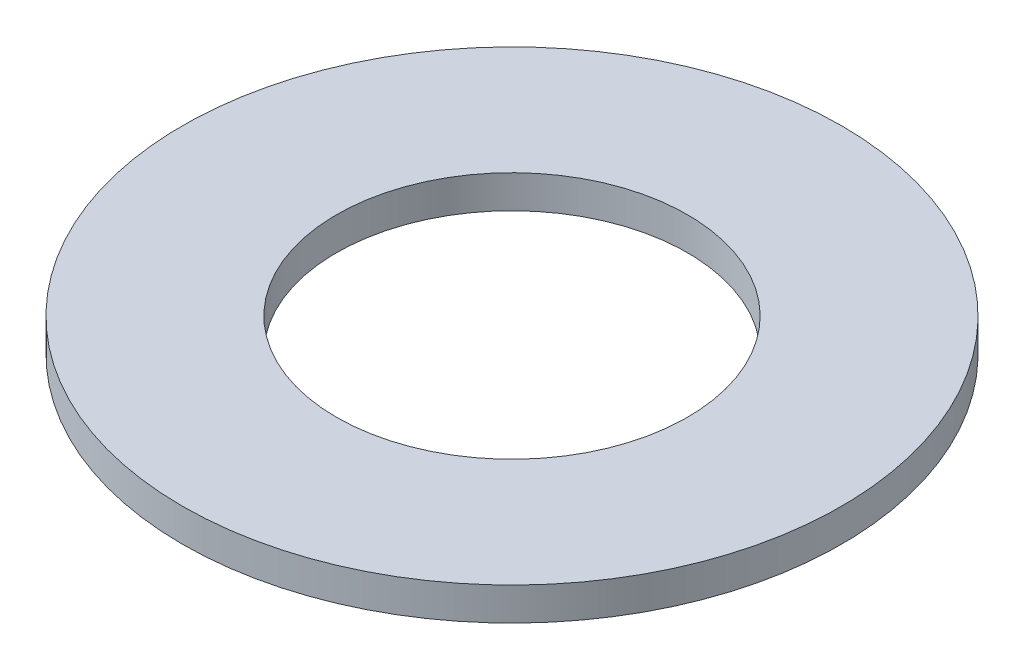
ISO-10303-21;
HEADER;
FILE_DESCRIPTION(('STEP AP214'),'2;1');
FILE_NAME('part.step','',(''),(''),'','','');
FILE_SCHEMA(('AUTOMOTIVE_DESIGN { 1 0 10303 214 1 1 1 1 }'));
ENDSEC;
DATA;
#1=APPLICATION_CONTEXT('core data for automotive mechanical design processes');
#2=APPLICATION_PROTOCOL_DEFINITION('international standard','automotive_design',2000,#1);
#3=PRODUCT_CONTEXT('',#1,'mechanical');
#4=PRODUCT('Part','Part','',(#3));
#5=PRODUCT_RELATED_PRODUCT_CATEGORY('part','',(#4));
#6=PRODUCT_DEFINITION_FORMATION('','',#4);
#7=PRODUCT_DEFINITION_CONTEXT('part definition',#1,'design');
#8=PRODUCT_DEFINITION('design','',#6,#7);
#9=PRODUCT_DEFINITION_SHAPE('','',#8);
#10=(LENGTH_UNIT() NAMED_UNIT(*) SI_UNIT(.MILLI.,.METRE.));
#11=(NAMED_UNIT(*) PLANE_ANGLE_UNIT() SI_UNIT($,.RADIAN.));
#12=(NAMED_UNIT(*) SI_UNIT($,.STERADIAN.) SOLID_ANGLE_UNIT());
#13=UNCERTAINTY_MEASURE_WITH_UNIT(LENGTH_MEASURE(1.E-05),#10,'distance_accuracy_value','');
#14=(GEOMETRIC_REPRESENTATION_CONTEXT(3) GLOBAL_UNCERTAINTY_ASSIGNED_CONTEXT((#13)) GLOBAL_UNIT_ASSIGNED_CONTEXT((#10,
#11,#12)) REPRESENTATION_CONTEXT('',''));
#15=CARTESIAN_POINT('',(0.,0.,0.));
#16=DIRECTION('',(0.,0.,1.));
#17=DIRECTION('',(1.,0.,0.));
#18=AXIS2_PLACEMENT_3D('',#15,#16,#17);
#19=CARTESIAN_POINT('',(0.,5.08,0.));
#20=DIRECTION('',(0.,1.,0.));
#21=DIRECTION('',(0.,0.,1.));
#22=AXIS2_PLACEMENT_3D('',#19,#20,#21);
#23=PLANE('',#22);
#24=CARTESIAN_POINT('',(0.,5.08,0.));
#25=DIRECTION('',(0.,1.,0.));
#26=DIRECTION('',(0.,0.,1.));
#27=AXIS2_PLACEMENT_3D('',#24,#25,#26);
#28=CIRCLE('',#27,50.8);
#29=CARTESIAN_POINT('',(0.,5.08,50.8));
#30=VERTEX_POINT('',#29);
#31=EDGE_CURVE('E10',#30,#30,#28,.T.);
#32=ORIENTED_EDGE('',*,*,#31,.T.);
#33=EDGE_LOOP('',(#32));
#34=FACE_BOUND('',#33,.T.);
#35=CARTESIAN_POINT('',(0.,5.08,0.));
#36=DIRECTION('',(0.,1.,0.));
#37=DIRECTION('',(0.,0.,1.));
#38=AXIS2_PLACEMENT_3D('',#35,#36,#37);
#39=CIRCLE('',#38,27.051);
#40=CARTESIAN_POINT('',(0.,5.08,27.051));
#41=VERTEX_POINT('',#40);
#42=EDGE_CURVE('E50',#41,#41,#39,.T.);
#43=ORIENTED_EDGE('',*,*,#42,.F.);
#44=EDGE_LOOP('',(#43));
#45=FACE_BOUND('',#44,.T.);
#46=ADVANCED_FACE('F37',(#34,#45),#23,.T.);
#47=CARTESIAN_POINT('',(0.,0.,0.));
#48=DIRECTION('',(0.,1.,0.));
#49=DIRECTION('',(0.,0.,1.));
#50=AXIS2_PLACEMENT_3D('',#47,#48,#49);
#51=PLANE('',#50);
#52=CARTESIAN_POINT('',(0.,0.,0.));
#53=DIRECTION('',(0.,1.,0.));
#54=DIRECTION('',(0.,0.,1.));
#55=AXIS2_PLACEMENT_3D('',#52,#53,#54);
#56=CIRCLE('',#55,50.8);
#57=CARTESIAN_POINT('',(0.,0.,50.8));
#58=VERTEX_POINT('',#57);
#59=EDGE_CURVE('E41',#58,#58,#56,.T.);
#60=ORIENTED_EDGE('',*,*,#59,.F.);
#61=EDGE_LOOP('',(#60));
#62=FACE_BOUND('',#61,.T.);
#63=CARTESIAN_POINT('',(0.,0.,0.));
#64=DIRECTION('',(0.,1.,0.));
#65=DIRECTION('',(0.,0.,1.));
#66=AXIS2_PLACEMENT_3D('',#63,#64,#65);
#67=CIRCLE('',#66,27.051);
#68=CARTESIAN_POINT('',(0.,0.,27.051));
#69=VERTEX_POINT('',#68);
#70=EDGE_CURVE('E52',#69,#69,#67,.T.);
#71=ORIENTED_EDGE('',*,*,#70,.T.);
#72=EDGE_LOOP('',(#71));
#73=FACE_BOUND('',#72,.T.);
#74=ADVANCED_FACE('F64',(#62,#73),#51,.F.);
#75=CARTESIAN_POINT('',(0.,5.08,0.));
#76=DIRECTION('',(0.,-1.,0.));
#77=DIRECTION('',(0.,0.,-1.));
#78=AXIS2_PLACEMENT_3D('',#75,#76,#77);
#79=CYLINDRICAL_SURFACE('',#78,50.8);
#80=ORIENTED_EDGE('',*,*,#31,.F.);
#81=EDGE_LOOP('',(#80));
#82=FACE_BOUND('',#81,.T.);
#83=ORIENTED_EDGE('',*,*,#59,.T.);
#84=EDGE_LOOP('',(#83));
#85=FACE_BOUND('',#84,.T.);
#86=ADVANCED_FACE('F39',(#82,#85),#79,.T.);
#87=CARTESIAN_POINT('',(0.,5.08,0.));
#88=DIRECTION('',(0.,-1.,0.));
#89=DIRECTION('',(0.,0.,-1.));
#90=AXIS2_PLACEMENT_3D('',#87,#88,#89);
#91=CYLINDRICAL_SURFACE('',#90,27.051);
#92=ORIENTED_EDGE('',*,*,#42,.T.);
#93=EDGE_LOOP('',(#92));
#94=FACE_BOUND('',#93,.T.);
#95=ORIENTED_EDGE('',*,*,#70,.F.);
#96=EDGE_LOOP('',(#95));
#97=FACE_BOUND('',#96,.T.);
#98=ADVANCED_FACE('F60',(#94,#97),#91,.F.);
#99=CLOSED_SHELL('',(#46,#74,#86,#98));
#100=MANIFOLD_SOLID_BREP('B2',#99);
#101=ADVANCED_BREP_SHAPE_REPRESENTATION('',(#18,#100),#14);
#102=SHAPE_DEFINITION_REPRESENTATION(#9,#101);
ENDSEC;
END-ISO-10303-21;
